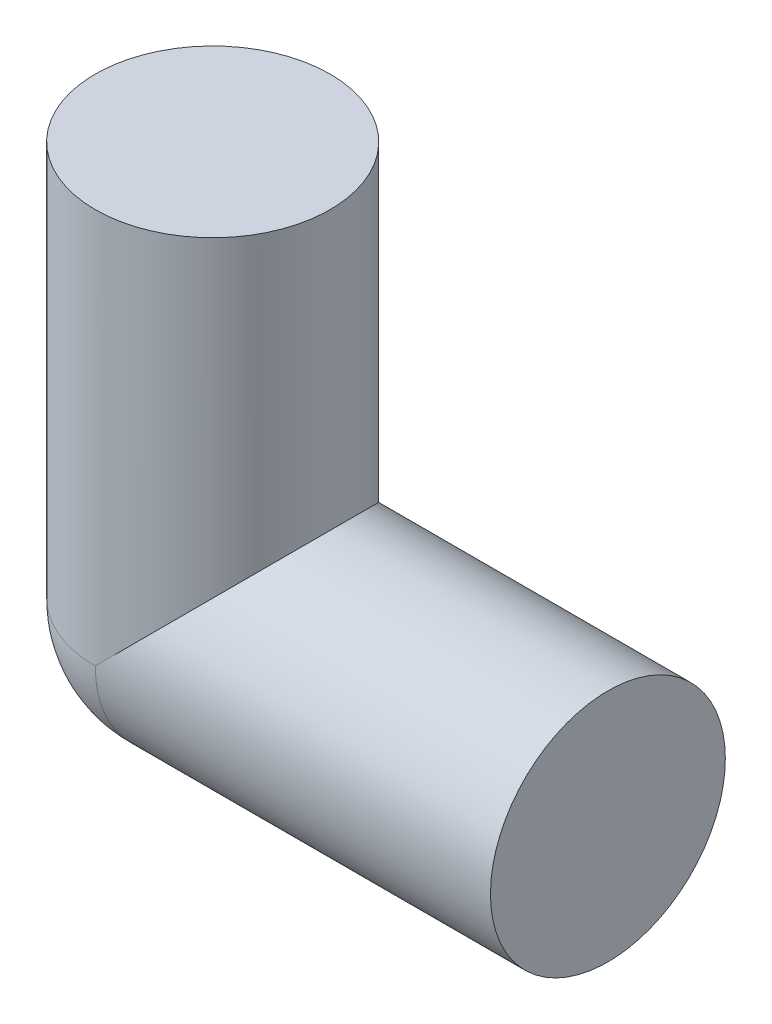
ISO-10303-21;
HEADER;
FILE_DESCRIPTION(('STEP AP214'),'2;1');
FILE_NAME('part.step','',(''),(''),'','','');
FILE_SCHEMA(('AUTOMOTIVE_DESIGN { 1 0 10303 214 1 1 1 1 }'));
ENDSEC;
DATA;
#1=APPLICATION_CONTEXT('core data for automotive mechanical design processes');
#2=APPLICATION_PROTOCOL_DEFINITION('international standard','automotive_design',2000,#1);
#3=PRODUCT_CONTEXT('',#1,'mechanical');
#4=PRODUCT('Part','Part','',(#3));
#5=PRODUCT_RELATED_PRODUCT_CATEGORY('part','',(#4));
#6=PRODUCT_DEFINITION_FORMATION('','',#4);
#7=PRODUCT_DEFINITION_CONTEXT('part definition',#1,'design');
#8=PRODUCT_DEFINITION('design','',#6,#7);
#9=PRODUCT_DEFINITION_SHAPE('','',#8);
#10=(LENGTH_UNIT() NAMED_UNIT(*) SI_UNIT(.MILLI.,.METRE.));
#11=(NAMED_UNIT(*) PLANE_ANGLE_UNIT() SI_UNIT($,.RADIAN.));
#12=(NAMED_UNIT(*) SI_UNIT($,.STERADIAN.) SOLID_ANGLE_UNIT());
#13=UNCERTAINTY_MEASURE_WITH_UNIT(LENGTH_MEASURE(1.E-05),#10,'distance_accuracy_value','');
#14=(GEOMETRIC_REPRESENTATION_CONTEXT(3) GLOBAL_UNCERTAINTY_ASSIGNED_CONTEXT((#13)) GLOBAL_UNIT_ASSIGNED_CONTEXT((#10,
#11,#12)) REPRESENTATION_CONTEXT('',''));
#15=CARTESIAN_POINT('',(0.,0.,0.));
#16=DIRECTION('',(0.,0.,1.));
#17=DIRECTION('',(1.,0.,0.));
#18=AXIS2_PLACEMENT_3D('',#15,#16,#17);
#19=CARTESIAN_POINT('',(0.,26.924,0.));
#20=DIRECTION('',(0.,-1.,0.));
#21=DIRECTION('',(0.,0.,-1.));
#22=AXIS2_PLACEMENT_3D('',#19,#20,#21);
#23=CYLINDRICAL_SURFACE('',#22,8.);
#24=CARTESIAN_POINT('',(0.,26.924,0.));
#25=DIRECTION('',(0.,1.,0.));
#26=DIRECTION('',(0.,0.,1.));
#27=AXIS2_PLACEMENT_3D('',#24,#25,#26);
#28=CIRCLE('',#27,8.);
#29=CARTESIAN_POINT('',(0.,26.924,8.));
#30=VERTEX_POINT('',#29);
#31=EDGE_CURVE('E11',#30,#30,#28,.T.);
#32=ORIENTED_EDGE('',*,*,#31,.F.);
#33=EDGE_LOOP('',(#32));
#34=FACE_BOUND('',#33,.T.);
#35=CARTESIAN_POINT('',(0.,0.,0.));
#36=DIRECTION('',(0.707106781186547,-0.707106781186547,0.));
#37=DIRECTION('',(-0.707106781186547,-0.707106781186547,0.));
#38=AXIS2_PLACEMENT_3D('',#35,#36,#37);
#39=ELLIPSE('',#38,11.3137084989848,8.);
#40=CARTESIAN_POINT('',(0.,0.,-8.));
#41=VERTEX_POINT('',#40);
#42=CARTESIAN_POINT('',(0.,0.,8.));
#43=VERTEX_POINT('',#42);
#44=EDGE_CURVE('E52',#41,#43,#39,.T.);
#45=ORIENTED_EDGE('',*,*,#44,.F.);
#46=CARTESIAN_POINT('',(0.,0.,0.));
#47=DIRECTION('',(0.,1.,0.));
#48=DIRECTION('',(0.,0.,1.));
#49=AXIS2_PLACEMENT_3D('',#46,#47,#48);
#50=CIRCLE('',#49,8.);
#51=EDGE_CURVE('E33',#41,#43,#50,.T.);
#52=ORIENTED_EDGE('',*,*,#51,.T.);
#53=EDGE_LOOP('',(#45,#52));
#54=FACE_BOUND('',#53,.T.);
#55=ADVANCED_FACE('F30',(#34,#54),#23,.T.);
#56=CARTESIAN_POINT('',(0.,26.924,0.));
#57=DIRECTION('',(0.,1.,0.));
#58=DIRECTION('',(0.,0.,1.));
#59=AXIS2_PLACEMENT_3D('',#56,#57,#58);
#60=PLANE('',#59);
#61=ORIENTED_EDGE('',*,*,#31,.T.);
#62=EDGE_LOOP('',(#61));
#63=FACE_BOUND('',#62,.T.);
#64=ADVANCED_FACE('F62',(#63),#60,.T.);
#65=CARTESIAN_POINT('',(26.924,0.,0.));
#66=DIRECTION('',(-1.,0.,0.));
#67=DIRECTION('',(0.,0.,1.));
#68=AXIS2_PLACEMENT_3D('',#65,#66,#67);
#69=CYLINDRICAL_SURFACE('',#68,8.);
#70=CARTESIAN_POINT('',(26.924,0.,0.));
#71=DIRECTION('',(1.,0.,0.));
#72=DIRECTION('',(0.,0.,-1.));
#73=AXIS2_PLACEMENT_3D('',#70,#71,#72);
#74=CIRCLE('',#73,8.);
#75=CARTESIAN_POINT('',(26.924,0.,-8.));
#76=VERTEX_POINT('',#75);
#77=EDGE_CURVE('E49',#76,#76,#74,.T.);
#78=ORIENTED_EDGE('',*,*,#77,.F.);
#79=EDGE_LOOP('',(#78));
#80=FACE_BOUND('',#79,.T.);
#81=CARTESIAN_POINT('',(0.,0.,0.));
#82=DIRECTION('',(1.,0.,0.));
#83=DIRECTION('',(0.,0.,-1.));
#84=AXIS2_PLACEMENT_3D('',#81,#82,#83);
#85=CIRCLE('',#84,8.);
#86=EDGE_CURVE('E45',#43,#41,#85,.T.);
#87=ORIENTED_EDGE('',*,*,#86,.T.);
#88=ORIENTED_EDGE('',*,*,#44,.T.);
#89=EDGE_LOOP('',(#87,#88));
#90=FACE_BOUND('',#89,.T.);
#91=ADVANCED_FACE('F53',(#80,#90),#69,.T.);
#92=CARTESIAN_POINT('',(26.924,0.,0.));
#93=DIRECTION('',(1.,0.,0.));
#94=DIRECTION('',(0.,0.,-1.));
#95=AXIS2_PLACEMENT_3D('',#92,#93,#94);
#96=PLANE('',#95);
#97=ORIENTED_EDGE('',*,*,#77,.T.);
#98=EDGE_LOOP('',(#97));
#99=FACE_BOUND('',#98,.T.);
#100=ADVANCED_FACE('F59',(#99),#96,.T.);
#101=CARTESIAN_POINT('',(0.,0.,0.));
#102=DIRECTION('',(0.,0.,1.));
#103=DIRECTION('',(-1.,0.,0.));
#104=AXIS2_PLACEMENT_3D('',#101,#102,#103);
#105=SPHERICAL_SURFACE('',#104,8.);
#106=ORIENTED_EDGE('',*,*,#86,.F.);
#107=ORIENTED_EDGE('',*,*,#51,.F.);
#108=EDGE_LOOP('',(#106,#107));
#109=FACE_BOUND('',#108,.T.);
#110=ADVANCED_FACE('F46',(#109),#105,.T.);
#111=CLOSED_SHELL('',(#55,#64,#91,#100,#110));
#112=MANIFOLD_SOLID_BREP('B2',#111);
#113=ADVANCED_BREP_SHAPE_REPRESENTATION('',(#18,#112),#14);
#114=SHAPE_DEFINITION_REPRESENTATION(#9,#113);
ENDSEC;
END-ISO-10303-21;
